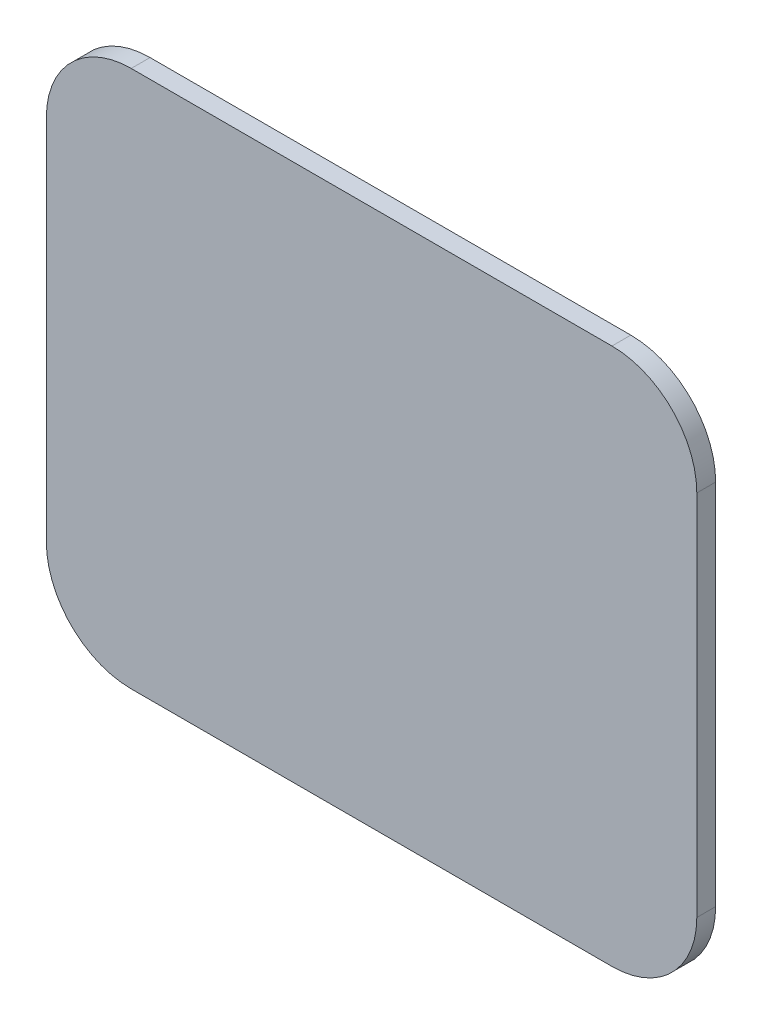
ISO-10303-21;
HEADER;
FILE_DESCRIPTION(('STEP AP214'),'2;1');
FILE_NAME('part.step','',(''),(''),'','','');
FILE_SCHEMA(('AUTOMOTIVE_DESIGN { 1 0 10303 214 1 1 1 1 }'));
ENDSEC;
DATA;
#1=APPLICATION_CONTEXT('core data for automotive mechanical design processes');
#2=APPLICATION_PROTOCOL_DEFINITION('international standard','automotive_design',2000,#1);
#3=PRODUCT_CONTEXT('',#1,'mechanical');
#4=PRODUCT('Part','Part','',(#3));
#5=PRODUCT_RELATED_PRODUCT_CATEGORY('part','',(#4));
#6=PRODUCT_DEFINITION_FORMATION('','',#4);
#7=PRODUCT_DEFINITION_CONTEXT('part definition',#1,'design');
#8=PRODUCT_DEFINITION('design','',#6,#7);
#9=PRODUCT_DEFINITION_SHAPE('','',#8);
#10=(LENGTH_UNIT() NAMED_UNIT(*) SI_UNIT(.MILLI.,.METRE.));
#11=(NAMED_UNIT(*) PLANE_ANGLE_UNIT() SI_UNIT($,.RADIAN.));
#12=(NAMED_UNIT(*) SI_UNIT($,.STERADIAN.) SOLID_ANGLE_UNIT());
#13=UNCERTAINTY_MEASURE_WITH_UNIT(LENGTH_MEASURE(1.E-05),#10,'distance_accuracy_value','');
#14=(GEOMETRIC_REPRESENTATION_CONTEXT(3) GLOBAL_UNCERTAINTY_ASSIGNED_CONTEXT((#13)) GLOBAL_UNIT_ASSIGNED_CONTEXT((#10,
#11,#12)) REPRESENTATION_CONTEXT('',''));
#15=CARTESIAN_POINT('',(0.,0.,0.));
#16=DIRECTION('',(0.,0.,1.));
#17=DIRECTION('',(1.,0.,0.));
#18=AXIS2_PLACEMENT_3D('',#15,#16,#17);
#19=CARTESIAN_POINT('',(0.,0.,1.));
#20=DIRECTION('',(1.,0.,0.));
#21=DIRECTION('',(0.,1.,0.));
#22=AXIS2_PLACEMENT_3D('',#19,#20,#21);
#23=PLANE('',#22);
#24=DIRECTION('',(0.,-1.,0.));
#25=VECTOR('',#24,1.);
#26=CARTESIAN_POINT('',(0.,0.,0.));
#27=LINE('',#26,#25);
#28=CARTESIAN_POINT('',(0.,24.,0.));
#29=VERTEX_POINT('',#28);
#30=CARTESIAN_POINT('',(0.,4.5,0.));
#31=VERTEX_POINT('',#30);
#32=EDGE_CURVE('E161',#29,#31,#27,.T.);
#33=ORIENTED_EDGE('',*,*,#32,.T.);
#34=DIRECTION('',(0.,0.,-1.));
#35=VECTOR('',#34,1.);
#36=CARTESIAN_POINT('',(0.,4.5,1.));
#37=LINE('',#36,#35);
#38=CARTESIAN_POINT('',(0.,4.5,1.));
#39=VERTEX_POINT('',#38);
#40=EDGE_CURVE('E11',#31,#39,#37,.F.);
#41=ORIENTED_EDGE('',*,*,#40,.T.);
#42=DIRECTION('',(0.,-1.,0.));
#43=VECTOR('',#42,1.);
#44=CARTESIAN_POINT('',(0.,0.,1.));
#45=LINE('',#44,#43);
#46=CARTESIAN_POINT('',(0.,24.,1.));
#47=VERTEX_POINT('',#46);
#48=EDGE_CURVE('E129',#47,#39,#45,.T.);
#49=ORIENTED_EDGE('',*,*,#48,.F.);
#50=DIRECTION('',(0.,0.,-1.));
#51=VECTOR('',#50,1.);
#52=CARTESIAN_POINT('',(0.,24.,1.));
#53=LINE('',#52,#51);
#54=EDGE_CURVE('E45',#47,#29,#53,.T.);
#55=ORIENTED_EDGE('',*,*,#54,.T.);
#56=EDGE_LOOP('',(#33,#41,#49,#55));
#57=FACE_BOUND('',#56,.T.);
#58=ADVANCED_FACE('F37',(#57),#23,.F.);
#59=CARTESIAN_POINT('',(0.,0.,1.));
#60=DIRECTION('',(0.,1.,0.));
#61=DIRECTION('',(0.,0.,1.));
#62=AXIS2_PLACEMENT_3D('',#59,#60,#61);
#63=PLANE('',#62);
#64=DIRECTION('',(1.,0.,0.));
#65=VECTOR('',#64,1.);
#66=CARTESIAN_POINT('',(0.,0.,0.));
#67=LINE('',#66,#65);
#68=CARTESIAN_POINT('',(4.5,0.,0.));
#69=VERTEX_POINT('',#68);
#70=CARTESIAN_POINT('',(30.,0.,0.));
#71=VERTEX_POINT('',#70);
#72=EDGE_CURVE('E134',#69,#71,#67,.T.);
#73=ORIENTED_EDGE('',*,*,#72,.T.);
#74=DIRECTION('',(0.,0.,-1.));
#75=VECTOR('',#74,1.);
#76=CARTESIAN_POINT('',(30.,0.,1.));
#77=LINE('',#76,#75);
#78=CARTESIAN_POINT('',(30.,0.,1.));
#79=VERTEX_POINT('',#78);
#80=EDGE_CURVE('E52',#71,#79,#77,.F.);
#81=ORIENTED_EDGE('',*,*,#80,.T.);
#82=DIRECTION('',(1.,0.,0.));
#83=VECTOR('',#82,1.);
#84=CARTESIAN_POINT('',(0.,0.,1.));
#85=LINE('',#84,#83);
#86=CARTESIAN_POINT('',(4.5,0.,1.));
#87=VERTEX_POINT('',#86);
#88=EDGE_CURVE('E132',#87,#79,#85,.T.);
#89=ORIENTED_EDGE('',*,*,#88,.F.);
#90=DIRECTION('',(0.,0.,-1.));
#91=VECTOR('',#90,1.);
#92=CARTESIAN_POINT('',(4.5,0.,1.));
#93=LINE('',#92,#91);
#94=EDGE_CURVE('E153',#87,#69,#93,.T.);
#95=ORIENTED_EDGE('',*,*,#94,.T.);
#96=EDGE_LOOP('',(#73,#81,#89,#95));
#97=FACE_BOUND('',#96,.T.);
#98=ADVANCED_FACE('F181',(#97),#63,.F.);
#99=CARTESIAN_POINT('',(34.5,0.,1.));
#100=DIRECTION('',(-1.,0.,0.));
#101=DIRECTION('',(0.,-1.,0.));
#102=AXIS2_PLACEMENT_3D('',#99,#100,#101);
#103=PLANE('',#102);
#104=DIRECTION('',(0.,1.,0.));
#105=VECTOR('',#104,1.);
#106=CARTESIAN_POINT('',(34.5,0.,0.));
#107=LINE('',#106,#105);
#108=CARTESIAN_POINT('',(34.5,4.5,0.));
#109=VERTEX_POINT('',#108);
#110=CARTESIAN_POINT('',(34.5,24.,0.));
#111=VERTEX_POINT('',#110);
#112=EDGE_CURVE('E130',#109,#111,#107,.T.);
#113=ORIENTED_EDGE('',*,*,#112,.T.);
#114=DIRECTION('',(0.,0.,-1.));
#115=VECTOR('',#114,1.);
#116=CARTESIAN_POINT('',(34.5,24.,1.));
#117=LINE('',#116,#115);
#118=CARTESIAN_POINT('',(34.5,24.,1.));
#119=VERTEX_POINT('',#118);
#120=EDGE_CURVE('E108',#111,#119,#117,.F.);
#121=ORIENTED_EDGE('',*,*,#120,.T.);
#122=DIRECTION('',(0.,1.,0.));
#123=VECTOR('',#122,1.);
#124=CARTESIAN_POINT('',(34.5,0.,1.));
#125=LINE('',#124,#123);
#126=CARTESIAN_POINT('',(34.5,4.5,1.));
#127=VERTEX_POINT('',#126);
#128=EDGE_CURVE('E169',#127,#119,#125,.T.);
#129=ORIENTED_EDGE('',*,*,#128,.F.);
#130=DIRECTION('',(0.,0.,-1.));
#131=VECTOR('',#130,1.);
#132=CARTESIAN_POINT('',(34.5,4.5,1.));
#133=LINE('',#132,#131);
#134=EDGE_CURVE('E113',#127,#109,#133,.T.);
#135=ORIENTED_EDGE('',*,*,#134,.T.);
#136=EDGE_LOOP('',(#113,#121,#129,#135));
#137=FACE_BOUND('',#136,.T.);
#138=ADVANCED_FACE('F180',(#137),#103,.F.);
#139=CARTESIAN_POINT('',(0.,28.5,1.));
#140=DIRECTION('',(0.,-1.,0.));
#141=DIRECTION('',(0.,0.,-1.));
#142=AXIS2_PLACEMENT_3D('',#139,#140,#141);
#143=PLANE('',#142);
#144=DIRECTION('',(-1.,0.,0.));
#145=VECTOR('',#144,1.);
#146=CARTESIAN_POINT('',(0.,28.5,1.));
#147=LINE('',#146,#145);
#148=CARTESIAN_POINT('',(30.,28.5,1.));
#149=VERTEX_POINT('',#148);
#150=CARTESIAN_POINT('',(4.49999999999999,28.5,1.));
#151=VERTEX_POINT('',#150);
#152=EDGE_CURVE('E123',#149,#151,#147,.T.);
#153=ORIENTED_EDGE('',*,*,#152,.F.);
#154=DIRECTION('',(0.,0.,-1.));
#155=VECTOR('',#154,1.);
#156=CARTESIAN_POINT('',(30.,28.5,1.));
#157=LINE('',#156,#155);
#158=CARTESIAN_POINT('',(30.,28.5,0.));
#159=VERTEX_POINT('',#158);
#160=EDGE_CURVE('E107',#149,#159,#157,.T.);
#161=ORIENTED_EDGE('',*,*,#160,.T.);
#162=DIRECTION('',(-1.,0.,0.));
#163=VECTOR('',#162,1.);
#164=CARTESIAN_POINT('',(0.,28.5,0.));
#165=LINE('',#164,#163);
#166=CARTESIAN_POINT('',(4.49999999999999,28.5,0.));
#167=VERTEX_POINT('',#166);
#168=EDGE_CURVE('E120',#159,#167,#165,.T.);
#169=ORIENTED_EDGE('',*,*,#168,.T.);
#170=DIRECTION('',(0.,0.,-1.));
#171=VECTOR('',#170,1.);
#172=CARTESIAN_POINT('',(4.49999999999999,28.5,1.));
#173=LINE('',#172,#171);
#174=EDGE_CURVE('E125',#167,#151,#173,.F.);
#175=ORIENTED_EDGE('',*,*,#174,.T.);
#176=EDGE_LOOP('',(#153,#161,#169,#175));
#177=FACE_BOUND('',#176,.T.);
#178=ADVANCED_FACE('F119',(#177),#143,.F.);
#179=CARTESIAN_POINT('',(0.,0.,1.));
#180=DIRECTION('',(0.,0.,-1.));
#181=DIRECTION('',(-1.,0.,0.));
#182=AXIS2_PLACEMENT_3D('',#179,#180,#181);
#183=PLANE('',#182);
#184=ORIENTED_EDGE('',*,*,#128,.T.);
#185=CARTESIAN_POINT('',(30.,24.,1.));
#186=DIRECTION('',(0.,0.,-1.));
#187=DIRECTION('',(-1.,0.,0.));
#188=AXIS2_PLACEMENT_3D('',#185,#186,#187);
#189=CIRCLE('',#188,4.5);
#190=EDGE_CURVE('E151',#119,#149,#189,.F.);
#191=ORIENTED_EDGE('',*,*,#190,.T.);
#192=ORIENTED_EDGE('',*,*,#152,.T.);
#193=CARTESIAN_POINT('',(4.49999999999999,24.,1.));
#194=DIRECTION('',(0.,0.,-1.));
#195=DIRECTION('',(-1.,0.,0.));
#196=AXIS2_PLACEMENT_3D('',#193,#194,#195);
#197=CIRCLE('',#196,4.5);
#198=EDGE_CURVE('E146',#151,#47,#197,.F.);
#199=ORIENTED_EDGE('',*,*,#198,.T.);
#200=ORIENTED_EDGE('',*,*,#48,.T.);
#201=CARTESIAN_POINT('',(4.5,4.5,1.));
#202=DIRECTION('',(0.,0.,-1.));
#203=DIRECTION('',(-1.,0.,0.));
#204=AXIS2_PLACEMENT_3D('',#201,#202,#203);
#205=CIRCLE('',#204,4.5);
#206=EDGE_CURVE('E59',#39,#87,#205,.F.);
#207=ORIENTED_EDGE('',*,*,#206,.T.);
#208=ORIENTED_EDGE('',*,*,#88,.T.);
#209=CARTESIAN_POINT('',(30.,4.5,1.));
#210=DIRECTION('',(0.,0.,-1.));
#211=DIRECTION('',(-1.,0.,0.));
#212=AXIS2_PLACEMENT_3D('',#209,#210,#211);
#213=CIRCLE('',#212,4.5);
#214=EDGE_CURVE('E149',#79,#127,#213,.F.);
#215=ORIENTED_EDGE('',*,*,#214,.T.);
#216=EDGE_LOOP('',(#184,#191,#192,#199,#200,#207,#208,#215));
#217=FACE_BOUND('',#216,.T.);
#218=ADVANCED_FACE('F173',(#217),#183,.F.);
#219=CARTESIAN_POINT('',(0.,0.,0.));
#220=DIRECTION('',(0.,0.,-1.));
#221=DIRECTION('',(-1.,0.,0.));
#222=AXIS2_PLACEMENT_3D('',#219,#220,#221);
#223=PLANE('',#222);
#224=ORIENTED_EDGE('',*,*,#168,.F.);
#225=CARTESIAN_POINT('',(30.,24.,0.));
#226=DIRECTION('',(0.,0.,-1.));
#227=DIRECTION('',(-1.,0.,0.));
#228=AXIS2_PLACEMENT_3D('',#225,#226,#227);
#229=CIRCLE('',#228,4.5);
#230=EDGE_CURVE('E103',#159,#111,#229,.T.);
#231=ORIENTED_EDGE('',*,*,#230,.T.);
#232=ORIENTED_EDGE('',*,*,#112,.F.);
#233=CARTESIAN_POINT('',(30.,4.5,0.));
#234=DIRECTION('',(0.,0.,-1.));
#235=DIRECTION('',(-1.,0.,0.));
#236=AXIS2_PLACEMENT_3D('',#233,#234,#235);
#237=CIRCLE('',#236,4.5);
#238=EDGE_CURVE('E114',#109,#71,#237,.T.);
#239=ORIENTED_EDGE('',*,*,#238,.T.);
#240=ORIENTED_EDGE('',*,*,#72,.F.);
#241=CARTESIAN_POINT('',(4.5,4.5,0.));
#242=DIRECTION('',(0.,0.,-1.));
#243=DIRECTION('',(-1.,0.,0.));
#244=AXIS2_PLACEMENT_3D('',#241,#242,#243);
#245=CIRCLE('',#244,4.5);
#246=EDGE_CURVE('E140',#69,#31,#245,.T.);
#247=ORIENTED_EDGE('',*,*,#246,.T.);
#248=ORIENTED_EDGE('',*,*,#32,.F.);
#249=CARTESIAN_POINT('',(4.49999999999999,24.,0.));
#250=DIRECTION('',(0.,0.,-1.));
#251=DIRECTION('',(-1.,0.,0.));
#252=AXIS2_PLACEMENT_3D('',#249,#250,#251);
#253=CIRCLE('',#252,4.5);
#254=EDGE_CURVE('E124',#29,#167,#253,.T.);
#255=ORIENTED_EDGE('',*,*,#254,.T.);
#256=EDGE_LOOP('',(#224,#231,#232,#239,#240,#247,#248,#255));
#257=FACE_BOUND('',#256,.T.);
#258=ADVANCED_FACE('F127',(#257),#223,.T.);
#259=CARTESIAN_POINT('',(30.,24.,1.));
#260=DIRECTION('',(0.,0.,-1.));
#261=DIRECTION('',(-1.,0.,0.));
#262=AXIS2_PLACEMENT_3D('',#259,#260,#261);
#263=CYLINDRICAL_SURFACE('',#262,4.5);
#264=ORIENTED_EDGE('',*,*,#190,.F.);
#265=ORIENTED_EDGE('',*,*,#120,.F.);
#266=ORIENTED_EDGE('',*,*,#230,.F.);
#267=ORIENTED_EDGE('',*,*,#160,.F.);
#268=EDGE_LOOP('',(#264,#265,#266,#267));
#269=FACE_BOUND('',#268,.T.);
#270=ADVANCED_FACE('F106',(#269),#263,.T.);
#271=CARTESIAN_POINT('',(30.,4.5,1.));
#272=DIRECTION('',(0.,0.,-1.));
#273=DIRECTION('',(-1.,0.,0.));
#274=AXIS2_PLACEMENT_3D('',#271,#272,#273);
#275=CYLINDRICAL_SURFACE('',#274,4.5);
#276=ORIENTED_EDGE('',*,*,#214,.F.);
#277=ORIENTED_EDGE('',*,*,#80,.F.);
#278=ORIENTED_EDGE('',*,*,#238,.F.);
#279=ORIENTED_EDGE('',*,*,#134,.F.);
#280=EDGE_LOOP('',(#276,#277,#278,#279));
#281=FACE_BOUND('',#280,.T.);
#282=ADVANCED_FACE('F178',(#281),#275,.T.);
#283=CARTESIAN_POINT('',(4.5,4.5,1.));
#284=DIRECTION('',(0.,0.,-1.));
#285=DIRECTION('',(-1.,0.,0.));
#286=AXIS2_PLACEMENT_3D('',#283,#284,#285);
#287=CYLINDRICAL_SURFACE('',#286,4.5);
#288=ORIENTED_EDGE('',*,*,#206,.F.);
#289=ORIENTED_EDGE('',*,*,#40,.F.);
#290=ORIENTED_EDGE('',*,*,#246,.F.);
#291=ORIENTED_EDGE('',*,*,#94,.F.);
#292=EDGE_LOOP('',(#288,#289,#290,#291));
#293=FACE_BOUND('',#292,.T.);
#294=ADVANCED_FACE('F183',(#293),#287,.T.);
#295=CARTESIAN_POINT('',(4.49999999999999,24.,1.));
#296=DIRECTION('',(0.,0.,-1.));
#297=DIRECTION('',(-1.,0.,0.));
#298=AXIS2_PLACEMENT_3D('',#295,#296,#297);
#299=CYLINDRICAL_SURFACE('',#298,4.5);
#300=ORIENTED_EDGE('',*,*,#198,.F.);
#301=ORIENTED_EDGE('',*,*,#174,.F.);
#302=ORIENTED_EDGE('',*,*,#254,.F.);
#303=ORIENTED_EDGE('',*,*,#54,.F.);
#304=EDGE_LOOP('',(#300,#301,#302,#303));
#305=FACE_BOUND('',#304,.T.);
#306=ADVANCED_FACE('F39',(#305),#299,.T.);
#307=CLOSED_SHELL('',(#58,#98,#138,#178,#218,#258,#270,#282,#294,#306));
#308=MANIFOLD_SOLID_BREP('B2',#307);
#309=ADVANCED_BREP_SHAPE_REPRESENTATION('',(#18,#308),#14);
#310=SHAPE_DEFINITION_REPRESENTATION(#9,#309);
ENDSEC;
END-ISO-10303-21;
